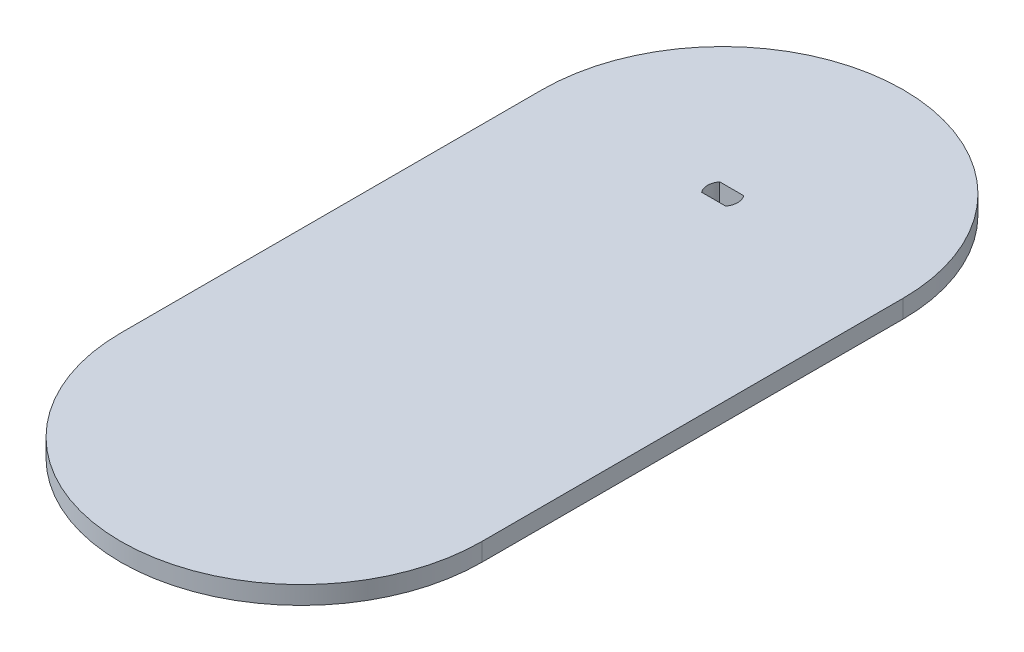
ISO-10303-21;
HEADER;
FILE_DESCRIPTION(('STEP AP214'),'2;1');
FILE_NAME('part.step','',(''),(''),'','','');
FILE_SCHEMA(('AUTOMOTIVE_DESIGN { 1 0 10303 214 1 1 1 1 }'));
ENDSEC;
DATA;
#1=APPLICATION_CONTEXT('core data for automotive mechanical design processes');
#2=APPLICATION_PROTOCOL_DEFINITION('international standard','automotive_design',2000,#1);
#3=PRODUCT_CONTEXT('',#1,'mechanical');
#4=PRODUCT('Part','Part','',(#3));
#5=PRODUCT_RELATED_PRODUCT_CATEGORY('part','',(#4));
#6=PRODUCT_DEFINITION_FORMATION('','',#4);
#7=PRODUCT_DEFINITION_CONTEXT('part definition',#1,'design');
#8=PRODUCT_DEFINITION('design','',#6,#7);
#9=PRODUCT_DEFINITION_SHAPE('','',#8);
#10=(LENGTH_UNIT() NAMED_UNIT(*) SI_UNIT(.MILLI.,.METRE.));
#11=(NAMED_UNIT(*) PLANE_ANGLE_UNIT() SI_UNIT($,.RADIAN.));
#12=(NAMED_UNIT(*) SI_UNIT($,.STERADIAN.) SOLID_ANGLE_UNIT());
#13=UNCERTAINTY_MEASURE_WITH_UNIT(LENGTH_MEASURE(1.E-05),#10,'distance_accuracy_value','');
#14=(GEOMETRIC_REPRESENTATION_CONTEXT(3) GLOBAL_UNCERTAINTY_ASSIGNED_CONTEXT((#13)) GLOBAL_UNIT_ASSIGNED_CONTEXT((#10,
#11,#12)) REPRESENTATION_CONTEXT('',''));
#15=CARTESIAN_POINT('',(0.,0.,0.));
#16=DIRECTION('',(0.,0.,1.));
#17=DIRECTION('',(1.,0.,0.));
#18=AXIS2_PLACEMENT_3D('',#15,#16,#17);
#19=CARTESIAN_POINT('',(0.,3.,70.));
#20=DIRECTION('',(0.,1.,0.));
#21=DIRECTION('',(0.,0.,1.));
#22=AXIS2_PLACEMENT_3D('',#19,#20,#21);
#23=PLANE('',#22);
#24=DIRECTION('',(0.,0.,1.));
#25=VECTOR('',#24,1.);
#26=CARTESIAN_POINT('',(30.,3.,0.));
#27=LINE('',#26,#25);
#28=CARTESIAN_POINT('',(30.,3.,0.));
#29=VERTEX_POINT('',#28);
#30=CARTESIAN_POINT('',(30.,3.,70.));
#31=VERTEX_POINT('',#30);
#32=EDGE_CURVE('E177',#29,#31,#27,.T.);
#33=ORIENTED_EDGE('',*,*,#32,.F.);
#34=CARTESIAN_POINT('',(0.,3.,0.));
#35=DIRECTION('',(0.,1.,0.));
#36=DIRECTION('',(0.,0.,1.));
#37=AXIS2_PLACEMENT_3D('',#34,#35,#36);
#38=CIRCLE('',#37,30.);
#39=CARTESIAN_POINT('',(-30.,3.,0.));
#40=VERTEX_POINT('',#39);
#41=EDGE_CURVE('E188',#29,#40,#38,.T.);
#42=ORIENTED_EDGE('',*,*,#41,.T.);
#43=DIRECTION('',(0.,0.,1.));
#44=VECTOR('',#43,1.);
#45=CARTESIAN_POINT('',(-30.,3.,0.));
#46=LINE('',#45,#44);
#47=CARTESIAN_POINT('',(-30.,3.,70.));
#48=VERTEX_POINT('',#47);
#49=EDGE_CURVE('E185',#40,#48,#46,.T.);
#50=ORIENTED_EDGE('',*,*,#49,.T.);
#51=CARTESIAN_POINT('',(0.,3.,70.));
#52=DIRECTION('',(0.,1.,0.));
#53=DIRECTION('',(0.,0.,1.));
#54=AXIS2_PLACEMENT_3D('',#51,#52,#53);
#55=CIRCLE('',#54,30.);
#56=EDGE_CURVE('E181',#48,#31,#55,.T.);
#57=ORIENTED_EDGE('',*,*,#56,.T.);
#58=EDGE_LOOP('',(#33,#42,#50,#57));
#59=FACE_BOUND('',#58,.T.);
#60=CARTESIAN_POINT('',(0.,3.,0.));
#61=DIRECTION('',(0.,1.,0.));
#62=DIRECTION('',(0.,0.,1.));
#63=AXIS2_PLACEMENT_3D('',#60,#61,#62);
#64=CIRCLE('',#63,2.5);
#65=CARTESIAN_POINT('',(-2.,3.,-1.5));
#66=VERTEX_POINT('',#65);
#67=CARTESIAN_POINT('',(-2.,3.,1.5));
#68=VERTEX_POINT('',#67);
#69=EDGE_CURVE('E140',#66,#68,#64,.T.);
#70=ORIENTED_EDGE('',*,*,#69,.F.);
#71=DIRECTION('',(-1.,0.,0.));
#72=VECTOR('',#71,1.);
#73=CARTESIAN_POINT('',(2.,3.,-1.5));
#74=LINE('',#73,#72);
#75=CARTESIAN_POINT('',(2.,3.,-1.5));
#76=VERTEX_POINT('',#75);
#77=EDGE_CURVE('E131',#76,#66,#74,.T.);
#78=ORIENTED_EDGE('',*,*,#77,.F.);
#79=CARTESIAN_POINT('',(0.,3.,0.));
#80=DIRECTION('',(0.,1.,0.));
#81=DIRECTION('',(0.,0.,1.));
#82=AXIS2_PLACEMENT_3D('',#79,#80,#81);
#83=CIRCLE('',#82,2.5);
#84=CARTESIAN_POINT('',(2.,3.,1.5));
#85=VERTEX_POINT('',#84);
#86=EDGE_CURVE('E154',#85,#76,#83,.T.);
#87=ORIENTED_EDGE('',*,*,#86,.F.);
#88=DIRECTION('',(-1.,0.,0.));
#89=VECTOR('',#88,1.);
#90=CARTESIAN_POINT('',(2.,3.,1.5));
#91=LINE('',#90,#89);
#92=EDGE_CURVE('E81',#85,#68,#91,.T.);
#93=ORIENTED_EDGE('',*,*,#92,.T.);
#94=EDGE_LOOP('',(#70,#78,#87,#93));
#95=FACE_BOUND('',#94,.T.);
#96=ADVANCED_FACE('F63',(#59,#95),#23,.T.);
#97=CARTESIAN_POINT('',(0.,0.,70.));
#98=DIRECTION('',(0.,1.,0.));
#99=DIRECTION('',(0.,0.,1.));
#100=AXIS2_PLACEMENT_3D('',#97,#98,#99);
#101=PLANE('',#100);
#102=DIRECTION('',(0.,0.,1.));
#103=VECTOR('',#102,1.);
#104=CARTESIAN_POINT('',(30.,0.,0.));
#105=LINE('',#104,#103);
#106=CARTESIAN_POINT('',(30.,0.,0.));
#107=VERTEX_POINT('',#106);
#108=CARTESIAN_POINT('',(30.,0.,70.));
#109=VERTEX_POINT('',#108);
#110=EDGE_CURVE('E148',#107,#109,#105,.T.);
#111=ORIENTED_EDGE('',*,*,#110,.T.);
#112=CARTESIAN_POINT('',(0.,0.,70.));
#113=DIRECTION('',(0.,1.,0.));
#114=DIRECTION('',(0.,0.,1.));
#115=AXIS2_PLACEMENT_3D('',#112,#113,#114);
#116=CIRCLE('',#115,30.);
#117=CARTESIAN_POINT('',(-30.,0.,70.));
#118=VERTEX_POINT('',#117);
#119=EDGE_CURVE('E194',#118,#109,#116,.T.);
#120=ORIENTED_EDGE('',*,*,#119,.F.);
#121=DIRECTION('',(0.,0.,1.));
#122=VECTOR('',#121,1.);
#123=CARTESIAN_POINT('',(-30.,0.,0.));
#124=LINE('',#123,#122);
#125=CARTESIAN_POINT('',(-30.,0.,0.));
#126=VERTEX_POINT('',#125);
#127=EDGE_CURVE('E198',#126,#118,#124,.T.);
#128=ORIENTED_EDGE('',*,*,#127,.F.);
#129=CARTESIAN_POINT('',(0.,0.,0.));
#130=DIRECTION('',(0.,1.,0.));
#131=DIRECTION('',(0.,0.,1.));
#132=AXIS2_PLACEMENT_3D('',#129,#130,#131);
#133=CIRCLE('',#132,30.);
#134=EDGE_CURVE('E182',#107,#126,#133,.T.);
#135=ORIENTED_EDGE('',*,*,#134,.F.);
#136=EDGE_LOOP('',(#111,#120,#128,#135));
#137=FACE_BOUND('',#136,.T.);
#138=DIRECTION('',(-1.,0.,0.));
#139=VECTOR('',#138,1.);
#140=CARTESIAN_POINT('',(2.,0.,-1.5));
#141=LINE('',#140,#139);
#142=CARTESIAN_POINT('',(2.,0.,-1.5));
#143=VERTEX_POINT('',#142);
#144=CARTESIAN_POINT('',(-2.,0.,-1.5));
#145=VERTEX_POINT('',#144);
#146=EDGE_CURVE('E89',#143,#145,#141,.T.);
#147=ORIENTED_EDGE('',*,*,#146,.T.);
#148=CARTESIAN_POINT('',(0.,0.,0.));
#149=DIRECTION('',(0.,1.,0.));
#150=DIRECTION('',(0.,0.,1.));
#151=AXIS2_PLACEMENT_3D('',#148,#149,#150);
#152=CIRCLE('',#151,2.5);
#153=CARTESIAN_POINT('',(-2.,0.,1.5));
#154=VERTEX_POINT('',#153);
#155=EDGE_CURVE('E146',#145,#154,#152,.T.);
#156=ORIENTED_EDGE('',*,*,#155,.T.);
#157=DIRECTION('',(-1.,0.,0.));
#158=VECTOR('',#157,1.);
#159=CARTESIAN_POINT('',(2.,0.,1.5));
#160=LINE('',#159,#158);
#161=CARTESIAN_POINT('',(2.,0.,1.5));
#162=VERTEX_POINT('',#161);
#163=EDGE_CURVE('E163',#162,#154,#160,.T.);
#164=ORIENTED_EDGE('',*,*,#163,.F.);
#165=CARTESIAN_POINT('',(0.,0.,0.));
#166=DIRECTION('',(0.,1.,0.));
#167=DIRECTION('',(0.,0.,1.));
#168=AXIS2_PLACEMENT_3D('',#165,#166,#167);
#169=CIRCLE('',#168,2.5);
#170=EDGE_CURVE('E141',#162,#143,#169,.T.);
#171=ORIENTED_EDGE('',*,*,#170,.T.);
#172=EDGE_LOOP('',(#147,#156,#164,#171));
#173=FACE_BOUND('',#172,.T.);
#174=ADVANCED_FACE('F221',(#137,#173),#101,.F.);
#175=CARTESIAN_POINT('',(30.,3.,0.));
#176=DIRECTION('',(1.,0.,0.));
#177=DIRECTION('',(0.,0.,-1.));
#178=AXIS2_PLACEMENT_3D('',#175,#176,#177);
#179=PLANE('',#178);
#180=ORIENTED_EDGE('',*,*,#110,.F.);
#181=DIRECTION('',(0.,-1.,0.));
#182=VECTOR('',#181,1.);
#183=CARTESIAN_POINT('',(30.,3.,0.));
#184=LINE('',#183,#182);
#185=EDGE_CURVE('E12',#29,#107,#184,.T.);
#186=ORIENTED_EDGE('',*,*,#185,.F.);
#187=ORIENTED_EDGE('',*,*,#32,.T.);
#188=DIRECTION('',(0.,-1.,0.));
#189=VECTOR('',#188,1.);
#190=CARTESIAN_POINT('',(30.,3.,70.));
#191=LINE('',#190,#189);
#192=EDGE_CURVE('E67',#31,#109,#191,.T.);
#193=ORIENTED_EDGE('',*,*,#192,.T.);
#194=EDGE_LOOP('',(#180,#186,#187,#193));
#195=FACE_BOUND('',#194,.T.);
#196=ADVANCED_FACE('F65',(#195),#179,.T.);
#197=CARTESIAN_POINT('',(0.,3.,0.));
#198=DIRECTION('',(0.,-1.,0.));
#199=DIRECTION('',(0.,0.,-1.));
#200=AXIS2_PLACEMENT_3D('',#197,#198,#199);
#201=CYLINDRICAL_SURFACE('',#200,30.);
#202=ORIENTED_EDGE('',*,*,#134,.T.);
#203=DIRECTION('',(0.,-1.,0.));
#204=VECTOR('',#203,1.);
#205=CARTESIAN_POINT('',(-30.,3.,0.));
#206=LINE('',#205,#204);
#207=EDGE_CURVE('E73',#40,#126,#206,.T.);
#208=ORIENTED_EDGE('',*,*,#207,.F.);
#209=ORIENTED_EDGE('',*,*,#41,.F.);
#210=ORIENTED_EDGE('',*,*,#185,.T.);
#211=EDGE_LOOP('',(#202,#208,#209,#210));
#212=FACE_BOUND('',#211,.T.);
#213=ADVANCED_FACE('F225',(#212),#201,.T.);
#214=CARTESIAN_POINT('',(-30.,3.,0.));
#215=DIRECTION('',(1.,0.,0.));
#216=DIRECTION('',(0.,0.,-1.));
#217=AXIS2_PLACEMENT_3D('',#214,#215,#216);
#218=PLANE('',#217);
#219=ORIENTED_EDGE('',*,*,#127,.T.);
#220=DIRECTION('',(0.,-1.,0.));
#221=VECTOR('',#220,1.);
#222=CARTESIAN_POINT('',(-30.,3.,70.));
#223=LINE('',#222,#221);
#224=EDGE_CURVE('E205',#48,#118,#223,.T.);
#225=ORIENTED_EDGE('',*,*,#224,.F.);
#226=ORIENTED_EDGE('',*,*,#49,.F.);
#227=ORIENTED_EDGE('',*,*,#207,.T.);
#228=EDGE_LOOP('',(#219,#225,#226,#227));
#229=FACE_BOUND('',#228,.T.);
#230=ADVANCED_FACE('F229',(#229),#218,.F.);
#231=CARTESIAN_POINT('',(0.,3.,70.));
#232=DIRECTION('',(0.,-1.,0.));
#233=DIRECTION('',(0.,0.,-1.));
#234=AXIS2_PLACEMENT_3D('',#231,#232,#233);
#235=CYLINDRICAL_SURFACE('',#234,30.);
#236=ORIENTED_EDGE('',*,*,#119,.T.);
#237=ORIENTED_EDGE('',*,*,#192,.F.);
#238=ORIENTED_EDGE('',*,*,#56,.F.);
#239=ORIENTED_EDGE('',*,*,#224,.T.);
#240=EDGE_LOOP('',(#236,#237,#238,#239));
#241=FACE_BOUND('',#240,.T.);
#242=ADVANCED_FACE('F217',(#241),#235,.T.);
#243=CARTESIAN_POINT('',(2.,3.,-1.5));
#244=DIRECTION('',(0.,0.,1.));
#245=DIRECTION('',(1.,0.,0.));
#246=AXIS2_PLACEMENT_3D('',#243,#244,#245);
#247=PLANE('',#246);
#248=ORIENTED_EDGE('',*,*,#146,.F.);
#249=DIRECTION('',(0.,-1.,0.));
#250=VECTOR('',#249,1.);
#251=CARTESIAN_POINT('',(2.,3.,-1.5));
#252=LINE('',#251,#250);
#253=EDGE_CURVE('E135',#76,#143,#252,.T.);
#254=ORIENTED_EDGE('',*,*,#253,.F.);
#255=ORIENTED_EDGE('',*,*,#77,.T.);
#256=DIRECTION('',(0.,-1.,0.));
#257=VECTOR('',#256,1.);
#258=CARTESIAN_POINT('',(-2.,3.,-1.5));
#259=LINE('',#258,#257);
#260=EDGE_CURVE('E134',#66,#145,#259,.T.);
#261=ORIENTED_EDGE('',*,*,#260,.T.);
#262=EDGE_LOOP('',(#248,#254,#255,#261));
#263=FACE_BOUND('',#262,.T.);
#264=ADVANCED_FACE('F133',(#263),#247,.T.);
#265=CARTESIAN_POINT('',(0.,3.,0.));
#266=DIRECTION('',(0.,-1.,0.));
#267=DIRECTION('',(0.,0.,-1.));
#268=AXIS2_PLACEMENT_3D('',#265,#266,#267);
#269=CYLINDRICAL_SURFACE('',#268,2.5);
#270=ORIENTED_EDGE('',*,*,#155,.F.);
#271=ORIENTED_EDGE('',*,*,#260,.F.);
#272=ORIENTED_EDGE('',*,*,#69,.T.);
#273=DIRECTION('',(0.,-1.,0.));
#274=VECTOR('',#273,1.);
#275=CARTESIAN_POINT('',(-2.,3.,1.5));
#276=LINE('',#275,#274);
#277=EDGE_CURVE('E149',#68,#154,#276,.T.);
#278=ORIENTED_EDGE('',*,*,#277,.T.);
#279=EDGE_LOOP('',(#270,#271,#272,#278));
#280=FACE_BOUND('',#279,.T.);
#281=ADVANCED_FACE('F144',(#280),#269,.F.);
#282=CARTESIAN_POINT('',(2.,3.,1.5));
#283=DIRECTION('',(0.,0.,1.));
#284=DIRECTION('',(1.,0.,0.));
#285=AXIS2_PLACEMENT_3D('',#282,#283,#284);
#286=PLANE('',#285);
#287=ORIENTED_EDGE('',*,*,#163,.T.);
#288=ORIENTED_EDGE('',*,*,#277,.F.);
#289=ORIENTED_EDGE('',*,*,#92,.F.);
#290=DIRECTION('',(0.,-1.,0.));
#291=VECTOR('',#290,1.);
#292=CARTESIAN_POINT('',(2.,3.,1.5));
#293=LINE('',#292,#291);
#294=EDGE_CURVE('E172',#85,#162,#293,.T.);
#295=ORIENTED_EDGE('',*,*,#294,.T.);
#296=EDGE_LOOP('',(#287,#288,#289,#295));
#297=FACE_BOUND('',#296,.T.);
#298=ADVANCED_FACE('F250',(#297),#286,.F.);
#299=CARTESIAN_POINT('',(0.,3.,0.));
#300=DIRECTION('',(0.,-1.,0.));
#301=DIRECTION('',(0.,0.,-1.));
#302=AXIS2_PLACEMENT_3D('',#299,#300,#301);
#303=CYLINDRICAL_SURFACE('',#302,2.5);
#304=ORIENTED_EDGE('',*,*,#170,.F.);
#305=ORIENTED_EDGE('',*,*,#294,.F.);
#306=ORIENTED_EDGE('',*,*,#86,.T.);
#307=ORIENTED_EDGE('',*,*,#253,.T.);
#308=EDGE_LOOP('',(#304,#305,#306,#307));
#309=FACE_BOUND('',#308,.T.);
#310=ADVANCED_FACE('F254',(#309),#303,.F.);
#311=CLOSED_SHELL('',(#96,#174,#196,#213,#230,#242,#264,#281,#298,#310));
#312=MANIFOLD_SOLID_BREP('B2',#311);
#313=ADVANCED_BREP_SHAPE_REPRESENTATION('',(#18,#312),#14);
#314=SHAPE_DEFINITION_REPRESENTATION(#9,#313);
ENDSEC;
END-ISO-10303-21;
